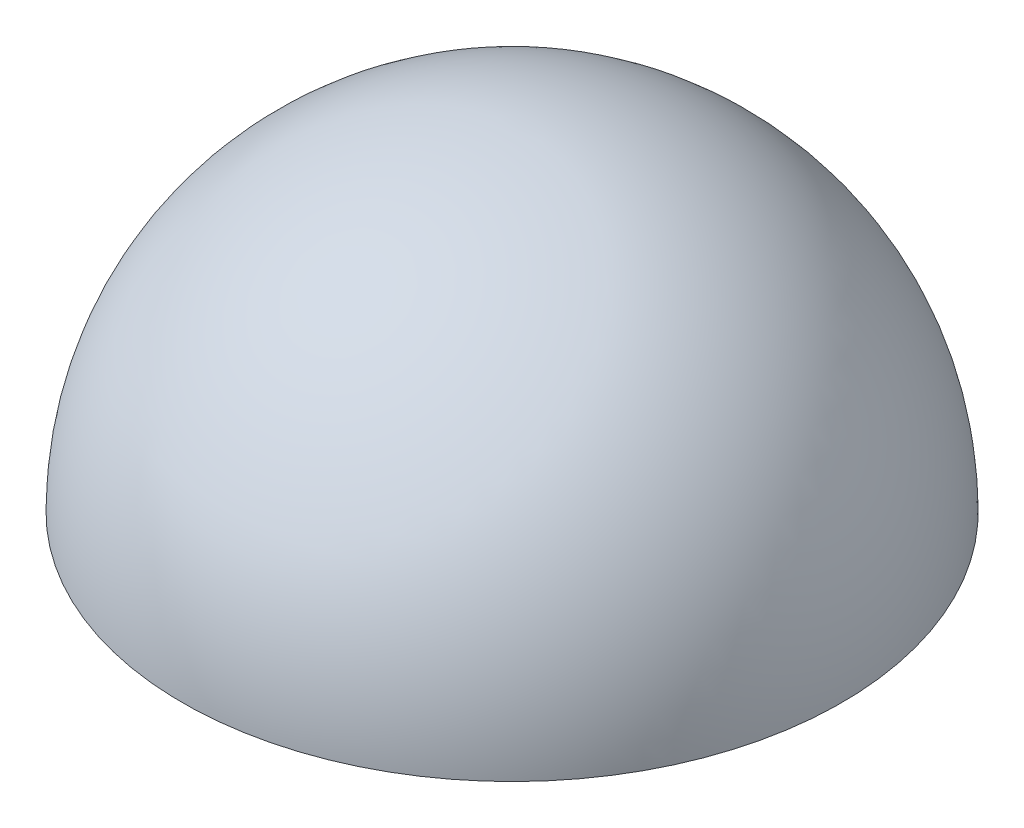
ISO-10303-21;
HEADER;
FILE_DESCRIPTION(('STEP AP214'),'2;1');
FILE_NAME('part.step','',(''),(''),'','','');
FILE_SCHEMA(('AUTOMOTIVE_DESIGN { 1 0 10303 214 1 1 1 1 }'));
ENDSEC;
DATA;
#1=APPLICATION_CONTEXT('core data for automotive mechanical design processes');
#2=APPLICATION_PROTOCOL_DEFINITION('international standard','automotive_design',2000,#1);
#3=PRODUCT_CONTEXT('',#1,'mechanical');
#4=PRODUCT('Part','Part','',(#3));
#5=PRODUCT_RELATED_PRODUCT_CATEGORY('part','',(#4));
#6=PRODUCT_DEFINITION_FORMATION('','',#4);
#7=PRODUCT_DEFINITION_CONTEXT('part definition',#1,'design');
#8=PRODUCT_DEFINITION('design','',#6,#7);
#9=PRODUCT_DEFINITION_SHAPE('','',#8);
#10=(LENGTH_UNIT() NAMED_UNIT(*) SI_UNIT(.MILLI.,.METRE.));
#11=(NAMED_UNIT(*) PLANE_ANGLE_UNIT() SI_UNIT($,.RADIAN.));
#12=(NAMED_UNIT(*) SI_UNIT($,.STERADIAN.) SOLID_ANGLE_UNIT());
#13=UNCERTAINTY_MEASURE_WITH_UNIT(LENGTH_MEASURE(1.E-05),#10,'distance_accuracy_value','');
#14=(GEOMETRIC_REPRESENTATION_CONTEXT(3) GLOBAL_UNCERTAINTY_ASSIGNED_CONTEXT((#13)) GLOBAL_UNIT_ASSIGNED_CONTEXT((#10,
#11,#12)) REPRESENTATION_CONTEXT('',''));
#15=CARTESIAN_POINT('',(0.,0.,0.));
#16=DIRECTION('',(0.,0.,1.));
#17=DIRECTION('',(1.,0.,0.));
#18=AXIS2_PLACEMENT_3D('',#15,#16,#17);
#19=CARTESIAN_POINT('',(0.,0.,0.));
#20=DIRECTION('',(0.,-1.,0.));
#21=DIRECTION('',(0.,0.,-1.));
#22=AXIS2_PLACEMENT_3D('',#19,#20,#21);
#23=PLANE('',#22);
#24=CARTESIAN_POINT('',(0.,0.,0.));
#25=DIRECTION('',(0.,-1.,0.));
#26=DIRECTION('',(0.,0.,-1.));
#27=AXIS2_PLACEMENT_3D('',#24,#25,#26);
#28=CIRCLE('',#27,40.);
#29=CARTESIAN_POINT('',(0.,2.79318507107451E-13,-40.));
#30=VERTEX_POINT('',#29);
#31=EDGE_CURVE('E346',#30,#30,#28,.T.);
#32=ORIENTED_EDGE('',*,*,#31,.T.);
#33=EDGE_LOOP('',(#32));
#34=FACE_BOUND('',#33,.T.);
#35=DIRECTION('',(-1.,0.,0.));
#36=VECTOR('',#35,1.);
#37=CARTESIAN_POINT('',(23.0953605473644,0.,0.600000000000003));
#38=LINE('',#37,#36);
#39=CARTESIAN_POINT('',(38.7953605473644,0.,0.6));
#40=VERTEX_POINT('',#39);
#41=CARTESIAN_POINT('',(24.0953605473644,0.,0.600000000000003));
#42=VERTEX_POINT('',#41);
#43=EDGE_CURVE('E48',#40,#42,#38,.T.);
#44=ORIENTED_EDGE('',*,*,#43,.T.);
#45=DIRECTION('',(0.,0.,1.));
#46=VECTOR('',#45,1.);
#47=CARTESIAN_POINT('',(24.0953605473644,0.,0.600000000000003));
#48=LINE('',#47,#46);
#49=CARTESIAN_POINT('',(24.0953605473644,0.,-0.6));
#50=VERTEX_POINT('',#49);
#51=EDGE_CURVE('E52',#50,#42,#48,.T.);
#52=ORIENTED_EDGE('',*,*,#51,.F.);
#53=DIRECTION('',(1.,0.,0.));
#54=VECTOR('',#53,1.);
#55=CARTESIAN_POINT('',(39.1,0.,-0.6));
#56=LINE('',#55,#54);
#57=CARTESIAN_POINT('',(38.7953605473644,0.,-0.6));
#58=VERTEX_POINT('',#57);
#59=EDGE_CURVE('E320',#50,#58,#56,.T.);
#60=ORIENTED_EDGE('',*,*,#59,.T.);
#61=CARTESIAN_POINT('',(0.,0.,0.));
#62=DIRECTION('',(0.,-1.,0.));
#63=DIRECTION('',(0.,0.,-1.));
#64=AXIS2_PLACEMENT_3D('',#61,#62,#63);
#65=CIRCLE('',#64,38.8);
#66=CARTESIAN_POINT('',(0.6,2.70906554769628E-13,-38.7953605473644));
#67=VERTEX_POINT('',#66);
#68=EDGE_CURVE('E347',#67,#58,#65,.T.);
#69=ORIENTED_EDGE('',*,*,#68,.F.);
#70=DIRECTION('',(0.,0.,1.));
#71=VECTOR('',#70,1.);
#72=CARTESIAN_POINT('',(0.6,1.61274040729954E-13,-23.0953605473644));
#73=LINE('',#72,#71);
#74=CARTESIAN_POINT('',(0.6,1.6825700340764E-13,-24.0953605473644));
#75=VERTEX_POINT('',#74);
#76=EDGE_CURVE('E307',#67,#75,#73,.T.);
#77=ORIENTED_EDGE('',*,*,#76,.T.);
#78=DIRECTION('',(1.,0.,0.));
#79=VECTOR('',#78,1.);
#80=CARTESIAN_POINT('',(-0.600000000000003,1.6825700340764E-13,-24.0953605473644));
#81=LINE('',#80,#79);
#82=CARTESIAN_POINT('',(-0.6,1.6825700340764E-13,-24.0953605473644));
#83=VERTEX_POINT('',#82);
#84=EDGE_CURVE('E228',#83,#75,#81,.T.);
#85=ORIENTED_EDGE('',*,*,#84,.F.);
#86=DIRECTION('',(0.,0.,-1.));
#87=VECTOR('',#86,1.);
#88=CARTESIAN_POINT('',(-0.6,2.73033840697533E-13,-39.1));
#89=LINE('',#88,#87);
#90=CARTESIAN_POINT('',(-0.6,2.70906554769628E-13,-38.7953605473644));
#91=VERTEX_POINT('',#90);
#92=EDGE_CURVE('E301',#83,#91,#89,.T.);
#93=ORIENTED_EDGE('',*,*,#92,.T.);
#94=CARTESIAN_POINT('',(-38.7953605473644,0.,-0.6));
#95=VERTEX_POINT('',#94);
#96=EDGE_CURVE('E343',#95,#91,#65,.T.);
#97=ORIENTED_EDGE('',*,*,#96,.F.);
#98=DIRECTION('',(1.,0.,0.));
#99=VECTOR('',#98,1.);
#100=CARTESIAN_POINT('',(-23.0953605473644,0.,-0.6));
#101=LINE('',#100,#99);
#102=CARTESIAN_POINT('',(-24.0953605473644,0.,-0.6));
#103=VERTEX_POINT('',#102);
#104=EDGE_CURVE('E331',#95,#103,#101,.T.);
#105=ORIENTED_EDGE('',*,*,#104,.T.);
#106=DIRECTION('',(0.,0.,-1.));
#107=VECTOR('',#106,1.);
#108=CARTESIAN_POINT('',(-24.0953605473644,0.,0.6));
#109=LINE('',#108,#107);
#110=CARTESIAN_POINT('',(-24.0953605473644,0.,0.6));
#111=VERTEX_POINT('',#110);
#112=EDGE_CURVE('E248',#111,#103,#109,.T.);
#113=ORIENTED_EDGE('',*,*,#112,.F.);
#114=DIRECTION('',(-1.,0.,0.));
#115=VECTOR('',#114,1.);
#116=CARTESIAN_POINT('',(-39.401492916685,0.,0.6));
#117=LINE('',#116,#115);
#118=CARTESIAN_POINT('',(-38.7953605473644,0.,0.6));
#119=VERTEX_POINT('',#118);
#120=EDGE_CURVE('E203',#111,#119,#117,.T.);
#121=ORIENTED_EDGE('',*,*,#120,.T.);
#122=CARTESIAN_POINT('',(-0.6,-2.70906554769628E-13,38.7953605473644));
#123=VERTEX_POINT('',#122);
#124=EDGE_CURVE('E341',#123,#119,#65,.T.);
#125=ORIENTED_EDGE('',*,*,#124,.F.);
#126=DIRECTION('',(0.,0.,-1.));
#127=VECTOR('',#126,1.);
#128=CARTESIAN_POINT('',(-0.600000000000003,-1.61274040729954E-13,23.0953605473644));
#129=LINE('',#128,#127);
#130=CARTESIAN_POINT('',(-0.600000000000003,-1.6825700340764E-13,24.0953605473644));
#131=VERTEX_POINT('',#130);
#132=EDGE_CURVE('E286',#123,#131,#129,.T.);
#133=ORIENTED_EDGE('',*,*,#132,.T.);
#134=DIRECTION('',(-1.,0.,0.));
#135=VECTOR('',#134,1.);
#136=CARTESIAN_POINT('',(-0.600000000000003,-1.6825700340764E-13,24.0953605473644));
#137=LINE('',#136,#135);
#138=CARTESIAN_POINT('',(0.6,-1.6825700340764E-13,24.0953605473644));
#139=VERTEX_POINT('',#138);
#140=EDGE_CURVE('E267',#139,#131,#137,.T.);
#141=ORIENTED_EDGE('',*,*,#140,.F.);
#142=DIRECTION('',(0.,0.,1.));
#143=VECTOR('',#142,1.);
#144=CARTESIAN_POINT('',(0.6,-2.73033840697533E-13,39.1));
#145=LINE('',#144,#143);
#146=CARTESIAN_POINT('',(0.6,-2.70906554769628E-13,38.7953605473644));
#147=VERTEX_POINT('',#146);
#148=EDGE_CURVE('E290',#139,#147,#145,.T.);
#149=ORIENTED_EDGE('',*,*,#148,.T.);
#150=EDGE_CURVE('E348',#40,#147,#65,.T.);
#151=ORIENTED_EDGE('',*,*,#150,.F.);
#152=EDGE_LOOP('',(#44,#52,#60,#69,#77,#85,#93,#97,#105,#113,#121,#125,#133,#141,#149,#151));
#153=FACE_BOUND('',#152,.T.);
#154=ADVANCED_FACE('F33',(#34,#153),#23,.T.);
#155=CARTESIAN_POINT('',(0.,0.,0.));
#156=DIRECTION('',(-1.,0.,0.));
#157=DIRECTION('',(0.,0.,1.));
#158=AXIS2_PLACEMENT_3D('',#155,#156,#157);
#159=SPHERICAL_SURFACE('',#158,40.);
#160=CARTESIAN_POINT('',(0.,0.,0.));
#161=DIRECTION('',(0.,-1.,0.));
#162=DIRECTION('',(0.,0.,-1.));
#163=AXIS2_PLACEMENT_3D('',#160,#161,#162);
#164=SPHERICAL_SURFACE('',#163,40.);
#165=ORIENTED_EDGE('',*,*,#31,.F.);
#166=EDGE_LOOP('',(#165));
#167=FACE_BOUND('',#166,.T.);
#168=ADVANCED_FACE('F35',(#167),#164,.T.);
#169=CARTESIAN_POINT('',(0.,0.,0.));
#170=DIRECTION('',(-1.,0.,0.));
#171=DIRECTION('',(0.,0.,1.));
#172=AXIS2_PLACEMENT_3D('',#169,#170,#171);
#173=SPHERICAL_SURFACE('',#172,38.8);
#174=CARTESIAN_POINT('',(-0.600000000000008,0.,0.));
#175=DIRECTION('',(-1.,0.,0.));
#176=DIRECTION('',(0.,0.,1.));
#177=AXIS2_PLACEMENT_3D('',#174,#175,#176);
#178=CIRCLE('',#177,38.7953605473644);
#179=CARTESIAN_POINT('',(-0.6,0.999999999999729,38.7824702668616));
#180=VERTEX_POINT('',#179);
#181=EDGE_CURVE('E11',#123,#180,#178,.T.);
#182=ORIENTED_EDGE('',*,*,#181,.F.);
#183=ORIENTED_EDGE('',*,*,#124,.T.);
#184=CARTESIAN_POINT('',(0.,0.,0.6));
#185=DIRECTION('',(0.,0.,1.));
#186=DIRECTION('',(0.,-1.,0.));
#187=AXIS2_PLACEMENT_3D('',#184,#185,#186);
#188=CIRCLE('',#187,38.7953605473644);
#189=CARTESIAN_POINT('',(-38.7824702668616,0.999999999999996,0.600000000000007));
#190=VERTEX_POINT('',#189);
#191=EDGE_CURVE('E357',#190,#119,#188,.T.);
#192=ORIENTED_EDGE('',*,*,#191,.F.);
#193=CARTESIAN_POINT('',(0.,1.,0.));
#194=DIRECTION('',(0.,1.,0.));
#195=DIRECTION('',(0.,0.,1.));
#196=AXIS2_PLACEMENT_3D('',#193,#194,#195);
#197=CIRCLE('',#196,38.7871112613456);
#198=CARTESIAN_POINT('',(-38.7824702668616,1.,-0.599999999999993));
#199=VERTEX_POINT('',#198);
#200=EDGE_CURVE('E351',#199,#190,#197,.T.);
#201=ORIENTED_EDGE('',*,*,#200,.F.);
#202=CARTESIAN_POINT('',(0.,0.,-0.599999999999999));
#203=DIRECTION('',(0.,0.,-1.));
#204=DIRECTION('',(0.,1.,0.));
#205=AXIS2_PLACEMENT_3D('',#202,#203,#204);
#206=CIRCLE('',#205,38.7953605473644);
#207=EDGE_CURVE('E354',#95,#199,#206,.T.);
#208=ORIENTED_EDGE('',*,*,#207,.F.);
#209=ORIENTED_EDGE('',*,*,#96,.T.);
#210=CARTESIAN_POINT('',(-0.6,0.,0.));
#211=DIRECTION('',(-1.,0.,0.));
#212=DIRECTION('',(0.,0.,1.));
#213=AXIS2_PLACEMENT_3D('',#210,#211,#212);
#214=CIRCLE('',#213,38.7953605473644);
#215=CARTESIAN_POINT('',(-0.6,1.00000000000027,-38.7824702668615));
#216=VERTEX_POINT('',#215);
#217=EDGE_CURVE('E375',#216,#91,#214,.T.);
#218=ORIENTED_EDGE('',*,*,#217,.F.);
#219=CARTESIAN_POINT('',(0.,1.,0.));
#220=DIRECTION('',(0.,1.,0.));
#221=DIRECTION('',(0.,0.,1.));
#222=AXIS2_PLACEMENT_3D('',#219,#220,#221);
#223=CIRCLE('',#222,38.7871112613456);
#224=CARTESIAN_POINT('',(0.6,1.00000000000027,-38.7824702668615));
#225=VERTEX_POINT('',#224);
#226=EDGE_CURVE('E369',#225,#216,#223,.T.);
#227=ORIENTED_EDGE('',*,*,#226,.F.);
#228=CARTESIAN_POINT('',(0.6,0.,0.));
#229=DIRECTION('',(1.,0.,0.));
#230=DIRECTION('',(0.,0.,-1.));
#231=AXIS2_PLACEMENT_3D('',#228,#229,#230);
#232=CIRCLE('',#231,38.7953605473644);
#233=EDGE_CURVE('E372',#67,#225,#232,.T.);
#234=ORIENTED_EDGE('',*,*,#233,.F.);
#235=ORIENTED_EDGE('',*,*,#68,.T.);
#236=CARTESIAN_POINT('',(0.,0.,-0.6));
#237=DIRECTION('',(0.,0.,-1.));
#238=DIRECTION('',(0.,1.,0.));
#239=AXIS2_PLACEMENT_3D('',#236,#237,#238);
#240=CIRCLE('',#239,38.7953605473644);
#241=CARTESIAN_POINT('',(38.7824702668616,1.,-0.599999999999993));
#242=VERTEX_POINT('',#241);
#243=EDGE_CURVE('E363',#242,#58,#240,.T.);
#244=ORIENTED_EDGE('',*,*,#243,.F.);
#245=CARTESIAN_POINT('',(0.,1.,0.));
#246=DIRECTION('',(0.,1.,0.));
#247=DIRECTION('',(0.,0.,1.));
#248=AXIS2_PLACEMENT_3D('',#245,#246,#247);
#249=CIRCLE('',#248,38.7871112613456);
#250=CARTESIAN_POINT('',(38.7824702668616,0.999999999999996,0.600000000000007));
#251=VERTEX_POINT('',#250);
#252=EDGE_CURVE('E360',#251,#242,#249,.T.);
#253=ORIENTED_EDGE('',*,*,#252,.F.);
#254=CARTESIAN_POINT('',(0.,0.,0.600000000000008));
#255=DIRECTION('',(0.,0.,1.));
#256=DIRECTION('',(0.,-1.,0.));
#257=AXIS2_PLACEMENT_3D('',#254,#255,#256);
#258=CIRCLE('',#257,38.7953605473644);
#259=EDGE_CURVE('E366',#40,#251,#258,.T.);
#260=ORIENTED_EDGE('',*,*,#259,.F.);
#261=ORIENTED_EDGE('',*,*,#150,.T.);
#262=CARTESIAN_POINT('',(0.6,0.,0.));
#263=DIRECTION('',(1.,0.,0.));
#264=DIRECTION('',(0.,0.,-1.));
#265=AXIS2_PLACEMENT_3D('',#262,#263,#264);
#266=CIRCLE('',#265,38.7953605473644);
#267=CARTESIAN_POINT('',(0.6,0.999999999999729,38.7824702668616));
#268=VERTEX_POINT('',#267);
#269=EDGE_CURVE('E41',#268,#147,#266,.T.);
#270=ORIENTED_EDGE('',*,*,#269,.F.);
#271=CARTESIAN_POINT('',(0.,1.,0.));
#272=DIRECTION('',(0.,1.,0.));
#273=DIRECTION('',(0.,0.,1.));
#274=AXIS2_PLACEMENT_3D('',#271,#272,#273);
#275=CIRCLE('',#274,38.7871112613456);
#276=EDGE_CURVE('E378',#180,#268,#275,.T.);
#277=ORIENTED_EDGE('',*,*,#276,.F.);
#278=EDGE_LOOP('',(#182,#183,#192,#201,#208,#209,#218,#227,#234,#235,#244,#253,#260,#261,#270,#277));
#279=FACE_BOUND('',#278,.T.);
#280=ADVANCED_FACE('F389',(#279),#173,.F.);
#281=CARTESIAN_POINT('',(-39.401492916685,0.999999999999996,0.600000000000007));
#282=DIRECTION('',(0.,0.,1.));
#283=DIRECTION('',(0.,-1.,0.));
#284=AXIS2_PLACEMENT_3D('',#281,#282,#283);
#285=PLANE('',#284);
#286=DIRECTION('',(-1.,0.,0.));
#287=VECTOR('',#286,1.);
#288=CARTESIAN_POINT('',(-39.401492916685,0.999999999999996,0.600000000000007));
#289=LINE('',#288,#287);
#290=CARTESIAN_POINT('',(-23.0953605473644,0.999999999999996,0.600000000000007));
#291=VERTEX_POINT('',#290);
#292=EDGE_CURVE('E327',#291,#190,#289,.T.);
#293=ORIENTED_EDGE('',*,*,#292,.T.);
#294=ORIENTED_EDGE('',*,*,#191,.T.);
#295=ORIENTED_EDGE('',*,*,#120,.F.);
#296=DIRECTION('',(0.,1.,0.));
#297=VECTOR('',#296,1.);
#298=CARTESIAN_POINT('',(-24.0953605473644,-5.,0.599999999999965));
#299=LINE('',#298,#297);
#300=CARTESIAN_POINT('',(-24.0953605473644,-5.,0.599999999999965));
#301=VERTEX_POINT('',#300);
#302=EDGE_CURVE('E264',#301,#111,#299,.T.);
#303=ORIENTED_EDGE('',*,*,#302,.F.);
#304=DIRECTION('',(-1.,0.,0.));
#305=VECTOR('',#304,1.);
#306=CARTESIAN_POINT('',(-23.0953605473644,-5.,0.599999999999965));
#307=LINE('',#306,#305);
#308=CARTESIAN_POINT('',(-23.0953605473644,-5.,0.599999999999965));
#309=VERTEX_POINT('',#308);
#310=EDGE_CURVE('E252',#309,#301,#307,.T.);
#311=ORIENTED_EDGE('',*,*,#310,.F.);
#312=DIRECTION('',(0.,-1.,0.));
#313=VECTOR('',#312,1.);
#314=CARTESIAN_POINT('',(-23.0953605473644,0.999999999999996,0.600000000000007));
#315=LINE('',#314,#313);
#316=EDGE_CURVE('E339',#291,#309,#315,.T.);
#317=ORIENTED_EDGE('',*,*,#316,.F.);
#318=EDGE_LOOP('',(#293,#294,#295,#303,#311,#317));
#319=FACE_BOUND('',#318,.T.);
#320=ADVANCED_FACE('F443',(#319),#285,.T.);
#321=CARTESIAN_POINT('',(-23.0953605473644,1.,-0.599999999999993));
#322=DIRECTION('',(0.,0.,-1.));
#323=DIRECTION('',(0.,1.,0.));
#324=AXIS2_PLACEMENT_3D('',#321,#322,#323);
#325=PLANE('',#324);
#326=ORIENTED_EDGE('',*,*,#104,.F.);
#327=ORIENTED_EDGE('',*,*,#207,.T.);
#328=DIRECTION('',(1.,0.,0.));
#329=VECTOR('',#328,1.);
#330=CARTESIAN_POINT('',(-23.0953605473644,1.,-0.599999999999993));
#331=LINE('',#330,#329);
#332=CARTESIAN_POINT('',(-23.0953605473644,1.,-0.599999999999993));
#333=VERTEX_POINT('',#332);
#334=EDGE_CURVE('E330',#199,#333,#331,.T.);
#335=ORIENTED_EDGE('',*,*,#334,.T.);
#336=DIRECTION('',(0.,-1.,0.));
#337=VECTOR('',#336,1.);
#338=CARTESIAN_POINT('',(-23.0953605473644,1.,-0.599999999999993));
#339=LINE('',#338,#337);
#340=CARTESIAN_POINT('',(-23.0953605473644,-5.,-0.600000000000035));
#341=VERTEX_POINT('',#340);
#342=EDGE_CURVE('E336',#333,#341,#339,.T.);
#343=ORIENTED_EDGE('',*,*,#342,.T.);
#344=DIRECTION('',(1.,0.,0.));
#345=VECTOR('',#344,1.);
#346=CARTESIAN_POINT('',(-23.0953605473644,-5.,-0.600000000000035));
#347=LINE('',#346,#345);
#348=CARTESIAN_POINT('',(-24.0953605473644,-5.,-0.600000000000035));
#349=VERTEX_POINT('',#348);
#350=EDGE_CURVE('E256',#349,#341,#347,.T.);
#351=ORIENTED_EDGE('',*,*,#350,.F.);
#352=DIRECTION('',(0.,1.,0.));
#353=VECTOR('',#352,1.);
#354=CARTESIAN_POINT('',(-24.0953605473644,-5.,-0.600000000000035));
#355=LINE('',#354,#353);
#356=EDGE_CURVE('E259',#349,#103,#355,.T.);
#357=ORIENTED_EDGE('',*,*,#356,.T.);
#358=EDGE_LOOP('',(#326,#327,#335,#343,#351,#357));
#359=FACE_BOUND('',#358,.T.);
#360=ADVANCED_FACE('F446',(#359),#325,.T.);
#361=CARTESIAN_POINT('',(0.,1.,0.));
#362=DIRECTION('',(0.,1.,0.));
#363=DIRECTION('',(0.,0.,1.));
#364=AXIS2_PLACEMENT_3D('',#361,#362,#363);
#365=PLANE('',#364);
#366=ORIENTED_EDGE('',*,*,#334,.F.);
#367=ORIENTED_EDGE('',*,*,#200,.T.);
#368=ORIENTED_EDGE('',*,*,#292,.F.);
#369=DIRECTION('',(0.,0.,1.));
#370=VECTOR('',#369,1.);
#371=CARTESIAN_POINT('',(-23.0953605473644,0.999999999999996,0.600000000000007));
#372=LINE('',#371,#370);
#373=EDGE_CURVE('E333',#333,#291,#372,.T.);
#374=ORIENTED_EDGE('',*,*,#373,.F.);
#375=EDGE_LOOP('',(#366,#367,#368,#374));
#376=FACE_BOUND('',#375,.T.);
#377=ADVANCED_FACE('F450',(#376),#365,.T.);
#378=CARTESIAN_POINT('',(-23.0953605473644,0.999999999999996,0.600000000000007));
#379=DIRECTION('',(1.,0.,0.));
#380=DIRECTION('',(0.,0.,-1.));
#381=AXIS2_PLACEMENT_3D('',#378,#379,#380);
#382=PLANE('',#381);
#383=ORIENTED_EDGE('',*,*,#316,.T.);
#384=DIRECTION('',(0.,0.,1.));
#385=VECTOR('',#384,1.);
#386=CARTESIAN_POINT('',(-23.0953605473644,-5.,0.599999999999965));
#387=LINE('',#386,#385);
#388=EDGE_CURVE('E249',#341,#309,#387,.T.);
#389=ORIENTED_EDGE('',*,*,#388,.F.);
#390=ORIENTED_EDGE('',*,*,#342,.F.);
#391=ORIENTED_EDGE('',*,*,#373,.T.);
#392=EDGE_LOOP('',(#383,#389,#390,#391));
#393=FACE_BOUND('',#392,.T.);
#394=ADVANCED_FACE('F452',(#393),#382,.T.);
#395=CARTESIAN_POINT('',(23.0953605473644,0.999999999999996,0.60000000000001));
#396=DIRECTION('',(0.,0.,1.));
#397=DIRECTION('',(0.,-1.,0.));
#398=AXIS2_PLACEMENT_3D('',#395,#396,#397);
#399=PLANE('',#398);
#400=ORIENTED_EDGE('',*,*,#43,.F.);
#401=ORIENTED_EDGE('',*,*,#259,.T.);
#402=DIRECTION('',(-1.,0.,0.));
#403=VECTOR('',#402,1.);
#404=CARTESIAN_POINT('',(23.0953605473644,0.999999999999996,0.60000000000001));
#405=LINE('',#404,#403);
#406=CARTESIAN_POINT('',(23.0953605473644,0.999999999999996,0.60000000000001));
#407=VERTEX_POINT('',#406);
#408=EDGE_CURVE('E318',#251,#407,#405,.T.);
#409=ORIENTED_EDGE('',*,*,#408,.T.);
#410=DIRECTION('',(0.,-1.,0.));
#411=VECTOR('',#410,1.);
#412=CARTESIAN_POINT('',(23.0953605473644,0.999999999999996,0.60000000000001));
#413=LINE('',#412,#411);
#414=CARTESIAN_POINT('',(23.0953605473644,-5.,0.599999999999968));
#415=VERTEX_POINT('',#414);
#416=EDGE_CURVE('E204',#407,#415,#413,.T.);
#417=ORIENTED_EDGE('',*,*,#416,.T.);
#418=DIRECTION('',(-1.,0.,0.));
#419=VECTOR('',#418,1.);
#420=CARTESIAN_POINT('',(23.0953605473644,-5.,0.599999999999968));
#421=LINE('',#420,#419);
#422=CARTESIAN_POINT('',(24.0953605473644,-5.,0.599999999999968));
#423=VERTEX_POINT('',#422);
#424=EDGE_CURVE('E218',#423,#415,#421,.T.);
#425=ORIENTED_EDGE('',*,*,#424,.F.);
#426=DIRECTION('',(0.,1.,0.));
#427=VECTOR('',#426,1.);
#428=CARTESIAN_POINT('',(24.0953605473644,-5.,0.599999999999968));
#429=LINE('',#428,#427);
#430=EDGE_CURVE('E223',#423,#42,#429,.T.);
#431=ORIENTED_EDGE('',*,*,#430,.T.);
#432=EDGE_LOOP('',(#400,#401,#409,#417,#425,#431));
#433=FACE_BOUND('',#432,.T.);
#434=ADVANCED_FACE('F419',(#433),#399,.T.);
#435=CARTESIAN_POINT('',(39.1,1.,-0.599999999999993));
#436=DIRECTION('',(0.,0.,-1.));
#437=DIRECTION('',(0.,1.,0.));
#438=AXIS2_PLACEMENT_3D('',#435,#436,#437);
#439=PLANE('',#438);
#440=DIRECTION('',(1.,0.,0.));
#441=VECTOR('',#440,1.);
#442=CARTESIAN_POINT('',(39.1,1.,-0.599999999999993));
#443=LINE('',#442,#441);
#444=CARTESIAN_POINT('',(23.0953605473644,1.,-0.599999999999993));
#445=VERTEX_POINT('',#444);
#446=EDGE_CURVE('E322',#445,#242,#443,.T.);
#447=ORIENTED_EDGE('',*,*,#446,.T.);
#448=ORIENTED_EDGE('',*,*,#243,.T.);
#449=ORIENTED_EDGE('',*,*,#59,.F.);
#450=DIRECTION('',(0.,1.,0.));
#451=VECTOR('',#450,1.);
#452=CARTESIAN_POINT('',(24.0953605473644,-5.,-0.600000000000035));
#453=LINE('',#452,#451);
#454=CARTESIAN_POINT('',(24.0953605473644,-5.,-0.600000000000035));
#455=VERTEX_POINT('',#454);
#456=EDGE_CURVE('E210',#455,#50,#453,.T.);
#457=ORIENTED_EDGE('',*,*,#456,.F.);
#458=DIRECTION('',(1.,0.,0.));
#459=VECTOR('',#458,1.);
#460=CARTESIAN_POINT('',(23.0953605473644,-5.,-0.600000000000035));
#461=LINE('',#460,#459);
#462=CARTESIAN_POINT('',(23.0953605473644,-5.,-0.600000000000035));
#463=VERTEX_POINT('',#462);
#464=EDGE_CURVE('E207',#463,#455,#461,.T.);
#465=ORIENTED_EDGE('',*,*,#464,.F.);
#466=DIRECTION('',(0.,-1.,0.));
#467=VECTOR('',#466,1.);
#468=CARTESIAN_POINT('',(23.0953605473644,1.,-0.599999999999993));
#469=LINE('',#468,#467);
#470=EDGE_CURVE('E192',#445,#463,#469,.T.);
#471=ORIENTED_EDGE('',*,*,#470,.F.);
#472=EDGE_LOOP('',(#447,#448,#449,#457,#465,#471));
#473=FACE_BOUND('',#472,.T.);
#474=ADVANCED_FACE('F208',(#473),#439,.T.);
#475=CARTESIAN_POINT('',(0.,1.,0.));
#476=DIRECTION('',(0.,1.,0.));
#477=DIRECTION('',(0.,0.,1.));
#478=AXIS2_PLACEMENT_3D('',#475,#476,#477);
#479=PLANE('',#478);
#480=ORIENTED_EDGE('',*,*,#408,.F.);
#481=ORIENTED_EDGE('',*,*,#252,.T.);
#482=ORIENTED_EDGE('',*,*,#446,.F.);
#483=DIRECTION('',(0.,0.,-1.));
#484=VECTOR('',#483,1.);
#485=CARTESIAN_POINT('',(23.0953605473644,0.999999999999996,0.60000000000001));
#486=LINE('',#485,#484);
#487=EDGE_CURVE('E199',#407,#445,#486,.T.);
#488=ORIENTED_EDGE('',*,*,#487,.F.);
#489=EDGE_LOOP('',(#480,#481,#482,#488));
#490=FACE_BOUND('',#489,.T.);
#491=ADVANCED_FACE('F417',(#490),#479,.T.);
#492=CARTESIAN_POINT('',(23.0953605473644,0.999999999999996,0.60000000000001));
#493=DIRECTION('',(-1.,0.,0.));
#494=DIRECTION('',(0.,0.,1.));
#495=AXIS2_PLACEMENT_3D('',#492,#493,#494);
#496=PLANE('',#495);
#497=ORIENTED_EDGE('',*,*,#470,.T.);
#498=DIRECTION('',(0.,0.,-1.));
#499=VECTOR('',#498,1.);
#500=CARTESIAN_POINT('',(23.0953605473644,-5.,0.599999999999968));
#501=LINE('',#500,#499);
#502=EDGE_CURVE('E197',#415,#463,#501,.T.);
#503=ORIENTED_EDGE('',*,*,#502,.F.);
#504=ORIENTED_EDGE('',*,*,#416,.F.);
#505=ORIENTED_EDGE('',*,*,#487,.T.);
#506=EDGE_LOOP('',(#497,#503,#504,#505));
#507=FACE_BOUND('',#506,.T.);
#508=ADVANCED_FACE('F194',(#507),#496,.T.);
#509=CARTESIAN_POINT('',(-0.6,1.00000000000027,-39.1));
#510=DIRECTION('',(-1.,0.,0.));
#511=DIRECTION('',(0.,0.,1.));
#512=AXIS2_PLACEMENT_3D('',#509,#510,#511);
#513=PLANE('',#512);
#514=DIRECTION('',(0.,0.,-1.));
#515=VECTOR('',#514,1.);
#516=CARTESIAN_POINT('',(-0.6,1.00000000000027,-39.1));
#517=LINE('',#516,#515);
#518=CARTESIAN_POINT('',(-0.6,1.00000000000016,-23.0953605473644));
#519=VERTEX_POINT('',#518);
#520=EDGE_CURVE('E303',#519,#216,#517,.T.);
#521=ORIENTED_EDGE('',*,*,#520,.T.);
#522=ORIENTED_EDGE('',*,*,#217,.T.);
#523=ORIENTED_EDGE('',*,*,#92,.F.);
#524=DIRECTION('',(0.,1.,0.));
#525=VECTOR('',#524,1.);
#526=CARTESIAN_POINT('',(-0.600000000000003,-4.99999999999983,-24.0953605473645));
#527=LINE('',#526,#525);
#528=CARTESIAN_POINT('',(-0.600000000000003,-4.99999999999983,-24.0953605473645));
#529=VERTEX_POINT('',#528);
#530=EDGE_CURVE('E245',#529,#83,#527,.T.);
#531=ORIENTED_EDGE('',*,*,#530,.F.);
#532=DIRECTION('',(0.,0.,-1.));
#533=VECTOR('',#532,1.);
#534=CARTESIAN_POINT('',(-0.6,-4.99999999999984,-23.0953605473645));
#535=LINE('',#534,#533);
#536=CARTESIAN_POINT('',(-0.6,-4.99999999999984,-23.0953605473645));
#537=VERTEX_POINT('',#536);
#538=EDGE_CURVE('E229',#537,#529,#535,.T.);
#539=ORIENTED_EDGE('',*,*,#538,.F.);
#540=DIRECTION('',(0.,-1.,0.));
#541=VECTOR('',#540,1.);
#542=CARTESIAN_POINT('',(-0.6,1.00000000000016,-23.0953605473644));
#543=LINE('',#542,#541);
#544=EDGE_CURVE('E315',#519,#537,#543,.T.);
#545=ORIENTED_EDGE('',*,*,#544,.F.);
#546=EDGE_LOOP('',(#521,#522,#523,#531,#539,#545));
#547=FACE_BOUND('',#546,.T.);
#548=ADVANCED_FACE('F463',(#547),#513,.T.);
#549=CARTESIAN_POINT('',(0.6,1.00000000000016,-23.0953605473644));
#550=DIRECTION('',(1.,0.,0.));
#551=DIRECTION('',(0.,0.,-1.));
#552=AXIS2_PLACEMENT_3D('',#549,#550,#551);
#553=PLANE('',#552);
#554=ORIENTED_EDGE('',*,*,#76,.F.);
#555=ORIENTED_EDGE('',*,*,#233,.T.);
#556=DIRECTION('',(0.,0.,1.));
#557=VECTOR('',#556,1.);
#558=CARTESIAN_POINT('',(0.6,1.00000000000016,-23.0953605473644));
#559=LINE('',#558,#557);
#560=CARTESIAN_POINT('',(0.6,1.00000000000016,-23.0953605473644));
#561=VERTEX_POINT('',#560);
#562=EDGE_CURVE('E306',#225,#561,#559,.T.);
#563=ORIENTED_EDGE('',*,*,#562,.T.);
#564=DIRECTION('',(0.,-1.,0.));
#565=VECTOR('',#564,1.);
#566=CARTESIAN_POINT('',(0.6,1.00000000000016,-23.0953605473644));
#567=LINE('',#566,#565);
#568=CARTESIAN_POINT('',(0.6,-4.99999999999984,-23.0953605473645));
#569=VERTEX_POINT('',#568);
#570=EDGE_CURVE('E312',#561,#569,#567,.T.);
#571=ORIENTED_EDGE('',*,*,#570,.T.);
#572=DIRECTION('',(0.,0.,1.));
#573=VECTOR('',#572,1.);
#574=CARTESIAN_POINT('',(0.6,-4.99999999999984,-23.0953605473645));
#575=LINE('',#574,#573);
#576=CARTESIAN_POINT('',(0.6,-4.99999999999983,-24.0953605473645));
#577=VERTEX_POINT('',#576);
#578=EDGE_CURVE('E234',#577,#569,#575,.T.);
#579=ORIENTED_EDGE('',*,*,#578,.F.);
#580=DIRECTION('',(0.,1.,0.));
#581=VECTOR('',#580,1.);
#582=CARTESIAN_POINT('',(0.6,-4.99999999999983,-24.0953605473645));
#583=LINE('',#582,#581);
#584=EDGE_CURVE('E240',#577,#75,#583,.T.);
#585=ORIENTED_EDGE('',*,*,#584,.T.);
#586=EDGE_LOOP('',(#554,#555,#563,#571,#579,#585));
#587=FACE_BOUND('',#586,.T.);
#588=ADVANCED_FACE('F470',(#587),#553,.T.);
#589=CARTESIAN_POINT('',(0.,1.,0.));
#590=DIRECTION('',(0.,1.,0.));
#591=DIRECTION('',(0.,0.,1.));
#592=AXIS2_PLACEMENT_3D('',#589,#590,#591);
#593=PLANE('',#592);
#594=ORIENTED_EDGE('',*,*,#562,.F.);
#595=ORIENTED_EDGE('',*,*,#226,.T.);
#596=ORIENTED_EDGE('',*,*,#520,.F.);
#597=DIRECTION('',(-1.,0.,0.));
#598=VECTOR('',#597,1.);
#599=CARTESIAN_POINT('',(-0.6,1.00000000000016,-23.0953605473644));
#600=LINE('',#599,#598);
#601=EDGE_CURVE('E309',#561,#519,#600,.T.);
#602=ORIENTED_EDGE('',*,*,#601,.F.);
#603=EDGE_LOOP('',(#594,#595,#596,#602));
#604=FACE_BOUND('',#603,.T.);
#605=ADVANCED_FACE('F474',(#604),#593,.T.);
#606=CARTESIAN_POINT('',(-0.6,1.00000000000016,-23.0953605473644));
#607=DIRECTION('',(0.,0.,1.));
#608=DIRECTION('',(0.,-1.,0.));
#609=AXIS2_PLACEMENT_3D('',#606,#607,#608);
#610=PLANE('',#609);
#611=ORIENTED_EDGE('',*,*,#544,.T.);
#612=DIRECTION('',(-1.,0.,0.));
#613=VECTOR('',#612,1.);
#614=CARTESIAN_POINT('',(-0.6,-4.99999999999984,-23.0953605473645));
#615=LINE('',#614,#613);
#616=EDGE_CURVE('E237',#569,#537,#615,.T.);
#617=ORIENTED_EDGE('',*,*,#616,.F.);
#618=ORIENTED_EDGE('',*,*,#570,.F.);
#619=ORIENTED_EDGE('',*,*,#601,.T.);
#620=EDGE_LOOP('',(#611,#617,#618,#619));
#621=FACE_BOUND('',#620,.T.);
#622=ADVANCED_FACE('F476',(#621),#610,.T.);
#623=CARTESIAN_POINT('',(-0.600000000000003,0.999999999999839,23.0953605473644));
#624=DIRECTION('',(-1.,0.,0.));
#625=DIRECTION('',(0.,0.,1.));
#626=AXIS2_PLACEMENT_3D('',#623,#624,#625);
#627=PLANE('',#626);
#628=ORIENTED_EDGE('',*,*,#132,.F.);
#629=ORIENTED_EDGE('',*,*,#181,.T.);
#630=DIRECTION('',(0.,0.,-1.));
#631=VECTOR('',#630,1.);
#632=CARTESIAN_POINT('',(-0.600000000000003,0.999999999999839,23.0953605473644));
#633=LINE('',#632,#631);
#634=CARTESIAN_POINT('',(-0.600000000000003,0.999999999999839,23.0953605473644));
#635=VERTEX_POINT('',#634);
#636=EDGE_CURVE('E287',#180,#635,#633,.T.);
#637=ORIENTED_EDGE('',*,*,#636,.T.);
#638=DIRECTION('',(0.,-1.,0.));
#639=VECTOR('',#638,1.);
#640=CARTESIAN_POINT('',(-0.600000000000003,0.999999999999839,23.0953605473644));
#641=LINE('',#640,#639);
#642=CARTESIAN_POINT('',(-0.600000000000003,-5.00000000000016,23.0953605473644));
#643=VERTEX_POINT('',#642);
#644=EDGE_CURVE('E296',#635,#643,#641,.T.);
#645=ORIENTED_EDGE('',*,*,#644,.T.);
#646=DIRECTION('',(0.,0.,-1.));
#647=VECTOR('',#646,1.);
#648=CARTESIAN_POINT('',(-0.600000000000003,-5.00000000000016,23.0953605473644));
#649=LINE('',#648,#647);
#650=CARTESIAN_POINT('',(-0.600000000000003,-5.00000000000017,24.0953605473644));
#651=VERTEX_POINT('',#650);
#652=EDGE_CURVE('E268',#651,#643,#649,.T.);
#653=ORIENTED_EDGE('',*,*,#652,.F.);
#654=DIRECTION('',(0.,1.,0.));
#655=VECTOR('',#654,1.);
#656=CARTESIAN_POINT('',(-0.600000000000003,-5.00000000000017,24.0953605473644));
#657=LINE('',#656,#655);
#658=EDGE_CURVE('E278',#651,#131,#657,.T.);
#659=ORIENTED_EDGE('',*,*,#658,.T.);
#660=EDGE_LOOP('',(#628,#629,#637,#645,#653,#659));
#661=FACE_BOUND('',#660,.T.);
#662=ADVANCED_FACE('F398',(#661),#627,.T.);
#663=CARTESIAN_POINT('',(0.6,0.999999999999727,39.1));
#664=DIRECTION('',(1.,0.,0.));
#665=DIRECTION('',(0.,0.,-1.));
#666=AXIS2_PLACEMENT_3D('',#663,#664,#665);
#667=PLANE('',#666);
#668=DIRECTION('',(0.,0.,1.));
#669=VECTOR('',#668,1.);
#670=CARTESIAN_POINT('',(0.6,0.999999999999727,39.1));
#671=LINE('',#670,#669);
#672=CARTESIAN_POINT('',(0.6,0.999999999999839,23.0953605473644));
#673=VERTEX_POINT('',#672);
#674=EDGE_CURVE('E293',#673,#268,#671,.T.);
#675=ORIENTED_EDGE('',*,*,#674,.T.);
#676=ORIENTED_EDGE('',*,*,#269,.T.);
#677=ORIENTED_EDGE('',*,*,#148,.F.);
#678=DIRECTION('',(0.,1.,0.));
#679=VECTOR('',#678,1.);
#680=CARTESIAN_POINT('',(0.6,-5.00000000000017,24.0953605473644));
#681=LINE('',#680,#679);
#682=CARTESIAN_POINT('',(0.6,-5.00000000000017,24.0953605473644));
#683=VERTEX_POINT('',#682);
#684=EDGE_CURVE('E283',#683,#139,#681,.T.);
#685=ORIENTED_EDGE('',*,*,#684,.F.);
#686=DIRECTION('',(0.,0.,1.));
#687=VECTOR('',#686,1.);
#688=CARTESIAN_POINT('',(0.6,-5.00000000000016,23.0953605473644));
#689=LINE('',#688,#687);
#690=CARTESIAN_POINT('',(0.6,-5.00000000000016,23.0953605473644));
#691=VERTEX_POINT('',#690);
#692=EDGE_CURVE('E274',#691,#683,#689,.T.);
#693=ORIENTED_EDGE('',*,*,#692,.F.);
#694=DIRECTION('',(0.,-1.,0.));
#695=VECTOR('',#694,1.);
#696=CARTESIAN_POINT('',(0.6,0.999999999999839,23.0953605473644));
#697=LINE('',#696,#695);
#698=EDGE_CURVE('E299',#673,#691,#697,.T.);
#699=ORIENTED_EDGE('',*,*,#698,.F.);
#700=EDGE_LOOP('',(#675,#676,#677,#685,#693,#699));
#701=FACE_BOUND('',#700,.T.);
#702=ADVANCED_FACE('F383',(#701),#667,.T.);
#703=CARTESIAN_POINT('',(0.,1.,0.));
#704=DIRECTION('',(0.,1.,0.));
#705=DIRECTION('',(0.,0.,1.));
#706=AXIS2_PLACEMENT_3D('',#703,#704,#705);
#707=PLANE('',#706);
#708=ORIENTED_EDGE('',*,*,#636,.F.);
#709=ORIENTED_EDGE('',*,*,#276,.T.);
#710=ORIENTED_EDGE('',*,*,#674,.F.);
#711=DIRECTION('',(1.,0.,0.));
#712=VECTOR('',#711,1.);
#713=CARTESIAN_POINT('',(-0.600000000000003,0.999999999999839,23.0953605473644));
#714=LINE('',#713,#712);
#715=EDGE_CURVE('E289',#635,#673,#714,.T.);
#716=ORIENTED_EDGE('',*,*,#715,.F.);
#717=EDGE_LOOP('',(#708,#709,#710,#716));
#718=FACE_BOUND('',#717,.T.);
#719=ADVANCED_FACE('F393',(#718),#707,.T.);
#720=CARTESIAN_POINT('',(-0.600000000000003,0.999999999999839,23.0953605473644));
#721=DIRECTION('',(0.,0.,-1.));
#722=DIRECTION('',(0.,1.,0.));
#723=AXIS2_PLACEMENT_3D('',#720,#721,#722);
#724=PLANE('',#723);
#725=ORIENTED_EDGE('',*,*,#698,.T.);
#726=DIRECTION('',(1.,0.,0.));
#727=VECTOR('',#726,1.);
#728=CARTESIAN_POINT('',(-0.600000000000003,-5.00000000000016,23.0953605473644));
#729=LINE('',#728,#727);
#730=EDGE_CURVE('E271',#643,#691,#729,.T.);
#731=ORIENTED_EDGE('',*,*,#730,.F.);
#732=ORIENTED_EDGE('',*,*,#644,.F.);
#733=ORIENTED_EDGE('',*,*,#715,.T.);
#734=EDGE_LOOP('',(#725,#731,#732,#733));
#735=FACE_BOUND('',#734,.T.);
#736=ADVANCED_FACE('F402',(#735),#724,.T.);
#737=CARTESIAN_POINT('',(-0.600000000000003,-5.00000000000017,24.0953605473644));
#738=DIRECTION('',(0.,0.,-1.));
#739=DIRECTION('',(0.,1.,0.));
#740=AXIS2_PLACEMENT_3D('',#737,#738,#739);
#741=PLANE('',#740);
#742=ORIENTED_EDGE('',*,*,#140,.T.);
#743=ORIENTED_EDGE('',*,*,#658,.F.);
#744=DIRECTION('',(-1.,0.,0.));
#745=VECTOR('',#744,1.);
#746=CARTESIAN_POINT('',(-0.600000000000003,-5.00000000000017,24.0953605473644));
#747=LINE('',#746,#745);
#748=EDGE_CURVE('E276',#683,#651,#747,.T.);
#749=ORIENTED_EDGE('',*,*,#748,.F.);
#750=ORIENTED_EDGE('',*,*,#684,.T.);
#751=EDGE_LOOP('',(#742,#743,#749,#750));
#752=FACE_BOUND('',#751,.T.);
#753=ADVANCED_FACE('F409',(#752),#741,.F.);
#754=CARTESIAN_POINT('',(0.,-5.,0.));
#755=DIRECTION('',(0.,1.,0.));
#756=DIRECTION('',(0.,0.,1.));
#757=AXIS2_PLACEMENT_3D('',#754,#755,#756);
#758=PLANE('',#757);
#759=ORIENTED_EDGE('',*,*,#652,.T.);
#760=ORIENTED_EDGE('',*,*,#730,.T.);
#761=ORIENTED_EDGE('',*,*,#692,.T.);
#762=ORIENTED_EDGE('',*,*,#748,.T.);
#763=EDGE_LOOP('',(#759,#760,#761,#762));
#764=FACE_BOUND('',#763,.T.);
#765=ADVANCED_FACE('F405',(#764),#758,.F.);
#766=CARTESIAN_POINT('',(-24.0953605473644,-5.,0.599999999999965));
#767=DIRECTION('',(1.,0.,0.));
#768=DIRECTION('',(0.,0.,-1.));
#769=AXIS2_PLACEMENT_3D('',#766,#767,#768);
#770=PLANE('',#769);
#771=ORIENTED_EDGE('',*,*,#112,.T.);
#772=ORIENTED_EDGE('',*,*,#356,.F.);
#773=DIRECTION('',(0.,0.,-1.));
#774=VECTOR('',#773,1.);
#775=CARTESIAN_POINT('',(-24.0953605473644,-5.,0.599999999999965));
#776=LINE('',#775,#774);
#777=EDGE_CURVE('E254',#301,#349,#776,.T.);
#778=ORIENTED_EDGE('',*,*,#777,.F.);
#779=ORIENTED_EDGE('',*,*,#302,.T.);
#780=EDGE_LOOP('',(#771,#772,#778,#779));
#781=FACE_BOUND('',#780,.T.);
#782=ADVANCED_FACE('F495',(#781),#770,.F.);
#783=CARTESIAN_POINT('',(0.,-5.,0.));
#784=DIRECTION('',(0.,1.,0.));
#785=DIRECTION('',(0.,0.,1.));
#786=AXIS2_PLACEMENT_3D('',#783,#784,#785);
#787=PLANE('',#786);
#788=ORIENTED_EDGE('',*,*,#388,.T.);
#789=ORIENTED_EDGE('',*,*,#310,.T.);
#790=ORIENTED_EDGE('',*,*,#777,.T.);
#791=ORIENTED_EDGE('',*,*,#350,.T.);
#792=EDGE_LOOP('',(#788,#789,#790,#791));
#793=FACE_BOUND('',#792,.T.);
#794=ADVANCED_FACE('F498',(#793),#787,.F.);
#795=CARTESIAN_POINT('',(-0.600000000000003,-4.99999999999983,-24.0953605473645));
#796=DIRECTION('',(0.,0.,1.));
#797=DIRECTION('',(0.,-1.,0.));
#798=AXIS2_PLACEMENT_3D('',#795,#796,#797);
#799=PLANE('',#798);
#800=ORIENTED_EDGE('',*,*,#84,.T.);
#801=ORIENTED_EDGE('',*,*,#584,.F.);
#802=DIRECTION('',(1.,0.,0.));
#803=VECTOR('',#802,1.);
#804=CARTESIAN_POINT('',(-0.600000000000003,-4.99999999999983,-24.0953605473645));
#805=LINE('',#804,#803);
#806=EDGE_CURVE('E232',#529,#577,#805,.T.);
#807=ORIENTED_EDGE('',*,*,#806,.F.);
#808=ORIENTED_EDGE('',*,*,#530,.T.);
#809=EDGE_LOOP('',(#800,#801,#807,#808));
#810=FACE_BOUND('',#809,.T.);
#811=ADVANCED_FACE('F431',(#810),#799,.F.);
#812=CARTESIAN_POINT('',(0.,-5.,0.));
#813=DIRECTION('',(0.,-1.,0.));
#814=DIRECTION('',(0.,0.,-1.));
#815=AXIS2_PLACEMENT_3D('',#812,#813,#814);
#816=PLANE('',#815);
#817=ORIENTED_EDGE('',*,*,#538,.T.);
#818=ORIENTED_EDGE('',*,*,#806,.T.);
#819=ORIENTED_EDGE('',*,*,#578,.T.);
#820=ORIENTED_EDGE('',*,*,#616,.T.);
#821=EDGE_LOOP('',(#817,#818,#819,#820));
#822=FACE_BOUND('',#821,.T.);
#823=ADVANCED_FACE('F424',(#822),#816,.T.);
#824=CARTESIAN_POINT('',(24.0953605473644,-5.,0.599999999999968));
#825=DIRECTION('',(-1.,0.,0.));
#826=DIRECTION('',(0.,0.,1.));
#827=AXIS2_PLACEMENT_3D('',#824,#825,#826);
#828=PLANE('',#827);
#829=ORIENTED_EDGE('',*,*,#51,.T.);
#830=ORIENTED_EDGE('',*,*,#430,.F.);
#831=DIRECTION('',(0.,0.,1.));
#832=VECTOR('',#831,1.);
#833=CARTESIAN_POINT('',(24.0953605473644,-5.,0.599999999999968));
#834=LINE('',#833,#832);
#835=EDGE_CURVE('E213',#455,#423,#834,.T.);
#836=ORIENTED_EDGE('',*,*,#835,.F.);
#837=ORIENTED_EDGE('',*,*,#456,.T.);
#838=EDGE_LOOP('',(#829,#830,#836,#837));
#839=FACE_BOUND('',#838,.T.);
#840=ADVANCED_FACE('F422',(#839),#828,.F.);
#841=CARTESIAN_POINT('',(0.,-5.,0.));
#842=DIRECTION('',(0.,-1.,0.));
#843=DIRECTION('',(0.,0.,-1.));
#844=AXIS2_PLACEMENT_3D('',#841,#842,#843);
#845=PLANE('',#844);
#846=ORIENTED_EDGE('',*,*,#502,.T.);
#847=ORIENTED_EDGE('',*,*,#464,.T.);
#848=ORIENTED_EDGE('',*,*,#835,.T.);
#849=ORIENTED_EDGE('',*,*,#424,.T.);
#850=EDGE_LOOP('',(#846,#847,#848,#849));
#851=FACE_BOUND('',#850,.T.);
#852=ADVANCED_FACE('F216',(#851),#845,.T.);
#853=CLOSED_SHELL('',(#154,#168,#280,#320,#360,#377,#394,#434,#474,#491,#508,#548,#588,#605,
#622,#662,#702,#719,#736,#753,#765,#782,#794,#811,#823,#840,#852));
#854=MANIFOLD_SOLID_BREP('B2',#853);
#855=ADVANCED_BREP_SHAPE_REPRESENTATION('',(#18,#854),#14);
#856=SHAPE_DEFINITION_REPRESENTATION(#9,#855);
ENDSEC;
END-ISO-10303-21;
